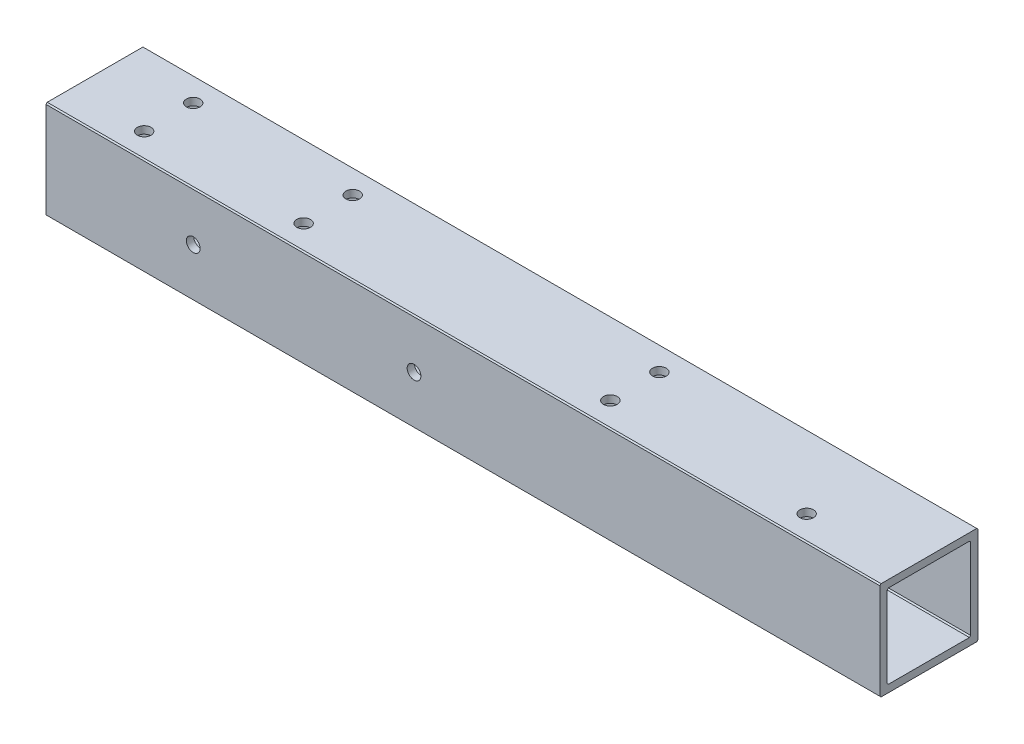
ISO-10303-21;
HEADER;
FILE_DESCRIPTION(('STEP AP214'),'2;1');
FILE_NAME('part.step','',(''),(''),'','','');
FILE_SCHEMA(('AUTOMOTIVE_DESIGN { 1 0 10303 214 1 1 1 1 }'));
ENDSEC;
DATA;
#1=APPLICATION_CONTEXT('core data for automotive mechanical design processes');
#2=APPLICATION_PROTOCOL_DEFINITION('international standard','automotive_design',2000,#1);
#3=PRODUCT_CONTEXT('',#1,'mechanical');
#4=PRODUCT('Part','Part','',(#3));
#5=PRODUCT_RELATED_PRODUCT_CATEGORY('part','',(#4));
#6=PRODUCT_DEFINITION_FORMATION('','',#4);
#7=PRODUCT_DEFINITION_CONTEXT('part definition',#1,'design');
#8=PRODUCT_DEFINITION('design','',#6,#7);
#9=PRODUCT_DEFINITION_SHAPE('','',#8);
#10=(LENGTH_UNIT() NAMED_UNIT(*) SI_UNIT(.MILLI.,.METRE.));
#11=(NAMED_UNIT(*) PLANE_ANGLE_UNIT() SI_UNIT($,.RADIAN.));
#12=(NAMED_UNIT(*) SI_UNIT($,.STERADIAN.) SOLID_ANGLE_UNIT());
#13=UNCERTAINTY_MEASURE_WITH_UNIT(LENGTH_MEASURE(1.E-05),#10,'distance_accuracy_value','');
#14=(GEOMETRIC_REPRESENTATION_CONTEXT(3) GLOBAL_UNCERTAINTY_ASSIGNED_CONTEXT((#13)) GLOBAL_UNIT_ASSIGNED_CONTEXT((#10,
#11,#12)) REPRESENTATION_CONTEXT('',''));
#15=CARTESIAN_POINT('',(0.,0.,0.));
#16=DIRECTION('',(0.,0.,1.));
#17=DIRECTION('',(1.,0.,0.));
#18=AXIS2_PLACEMENT_3D('',#15,#16,#17);
#19=CARTESIAN_POINT('',(-250.,102.,140.));
#20=DIRECTION('',(0.,0.,1.));
#21=DIRECTION('',(1.,0.,0.));
#22=AXIS2_PLACEMENT_3D('',#19,#20,#21);
#23=PLANE('',#22);
#24=CARTESIAN_POINT('',(-100.,122.,140.));
#25=DIRECTION('',(0.,0.,-1.));
#26=DIRECTION('',(-1.,0.,0.));
#27=AXIS2_PLACEMENT_3D('',#24,#25,#26);
#28=CIRCLE('',#27,2.79999999999998);
#29=CARTESIAN_POINT('',(-102.8,122.,140.));
#30=VERTEX_POINT('',#29);
#31=EDGE_CURVE('E605',#30,#30,#28,.T.);
#32=ORIENTED_EDGE('',*,*,#31,.T.);
#33=EDGE_LOOP('',(#32));
#34=FACE_BOUND('',#33,.T.);
#35=CARTESIAN_POINT('',(-190.,122.,140.));
#36=DIRECTION('',(0.,0.,-1.));
#37=DIRECTION('',(-1.,0.,0.));
#38=AXIS2_PLACEMENT_3D('',#35,#36,#37);
#39=CIRCLE('',#38,2.8);
#40=CARTESIAN_POINT('',(-192.8,122.,140.));
#41=VERTEX_POINT('',#40);
#42=EDGE_CURVE('E617',#41,#41,#39,.T.);
#43=ORIENTED_EDGE('',*,*,#42,.T.);
#44=EDGE_LOOP('',(#43));
#45=FACE_BOUND('',#44,.T.);
#46=DIRECTION('',(0.,1.,0.));
#47=VECTOR('',#46,1.);
#48=CARTESIAN_POINT('',(89.85,102.,140.));
#49=LINE('',#48,#47);
#50=CARTESIAN_POINT('',(89.85,102.5,140.));
#51=VERTEX_POINT('',#50);
#52=CARTESIAN_POINT('',(89.85,141.5,140.));
#53=VERTEX_POINT('',#52);
#54=EDGE_CURVE('E185',#51,#53,#49,.T.);
#55=ORIENTED_EDGE('',*,*,#54,.T.);
#56=DIRECTION('',(-1.,0.,0.));
#57=VECTOR('',#56,1.);
#58=CARTESIAN_POINT('',(-250.,141.5,140.));
#59=LINE('',#58,#57);
#60=CARTESIAN_POINT('',(-250.,141.5,140.));
#61=VERTEX_POINT('',#60);
#62=EDGE_CURVE('E229',#53,#61,#59,.T.);
#63=ORIENTED_EDGE('',*,*,#62,.T.);
#64=DIRECTION('',(0.,1.,0.));
#65=VECTOR('',#64,1.);
#66=CARTESIAN_POINT('',(-250.,102.,140.));
#67=LINE('',#66,#65);
#68=CARTESIAN_POINT('',(-250.,102.5,140.));
#69=VERTEX_POINT('',#68);
#70=EDGE_CURVE('E196',#69,#61,#67,.T.);
#71=ORIENTED_EDGE('',*,*,#70,.F.);
#72=DIRECTION('',(1.,0.,0.));
#73=VECTOR('',#72,1.);
#74=CARTESIAN_POINT('',(89.85,102.5,140.));
#75=LINE('',#74,#73);
#76=EDGE_CURVE('E226',#69,#51,#75,.T.);
#77=ORIENTED_EDGE('',*,*,#76,.T.);
#78=EDGE_LOOP('',(#55,#63,#71,#77));
#79=FACE_BOUND('',#78,.T.);
#80=ADVANCED_FACE('F45',(#34,#45,#79),#23,.T.);
#81=CARTESIAN_POINT('',(-250.,102.,100.));
#82=DIRECTION('',(-1.,0.,0.));
#83=DIRECTION('',(0.,0.,1.));
#84=AXIS2_PLACEMENT_3D('',#81,#82,#83);
#85=PLANE('',#84);
#86=DIRECTION('',(0.,-1.,0.));
#87=VECTOR('',#86,1.);
#88=CARTESIAN_POINT('',(-250.,139.,103.));
#89=LINE('',#88,#87);
#90=CARTESIAN_POINT('',(-250.,138.5,103.));
#91=VERTEX_POINT('',#90);
#92=CARTESIAN_POINT('',(-250.,105.5,103.));
#93=VERTEX_POINT('',#92);
#94=EDGE_CURVE('E286',#91,#93,#89,.T.);
#95=ORIENTED_EDGE('',*,*,#94,.F.);
#96=DIRECTION('',(0.,-0.707106781186548,-0.707106781186548));
#97=VECTOR('',#96,1.);
#98=CARTESIAN_POINT('',(-250.,138.5,103.));
#99=LINE('',#98,#97);
#100=CARTESIAN_POINT('',(-250.,139.,103.5));
#101=VERTEX_POINT('',#100);
#102=EDGE_CURVE('E55',#91,#101,#99,.F.);
#103=ORIENTED_EDGE('',*,*,#102,.T.);
#104=DIRECTION('',(0.,0.,-1.));
#105=VECTOR('',#104,1.);
#106=CARTESIAN_POINT('',(-250.,139.,137.));
#107=LINE('',#106,#105);
#108=CARTESIAN_POINT('',(-250.,139.,136.5));
#109=VERTEX_POINT('',#108);
#110=EDGE_CURVE('E284',#109,#101,#107,.T.);
#111=ORIENTED_EDGE('',*,*,#110,.F.);
#112=DIRECTION('',(0.,0.707106781186548,-0.707106781186548));
#113=VECTOR('',#112,1.);
#114=CARTESIAN_POINT('',(-250.,139.,136.5));
#115=LINE('',#114,#113);
#116=CARTESIAN_POINT('',(-250.,138.5,137.));
#117=VERTEX_POINT('',#116);
#118=EDGE_CURVE('E260',#109,#117,#115,.F.);
#119=ORIENTED_EDGE('',*,*,#118,.T.);
#120=DIRECTION('',(0.,1.,0.));
#121=VECTOR('',#120,1.);
#122=CARTESIAN_POINT('',(-250.,105.,137.));
#123=LINE('',#122,#121);
#124=CARTESIAN_POINT('',(-250.,105.5,137.));
#125=VERTEX_POINT('',#124);
#126=EDGE_CURVE('E297',#125,#117,#123,.T.);
#127=ORIENTED_EDGE('',*,*,#126,.F.);
#128=DIRECTION('',(0.,0.707106781186548,0.707106781186548));
#129=VECTOR('',#128,1.);
#130=CARTESIAN_POINT('',(-250.,105.5,137.));
#131=LINE('',#130,#129);
#132=CARTESIAN_POINT('',(-250.,105.,136.5));
#133=VERTEX_POINT('',#132);
#134=EDGE_CURVE('E272',#125,#133,#131,.F.);
#135=ORIENTED_EDGE('',*,*,#134,.T.);
#136=DIRECTION('',(0.,0.,1.));
#137=VECTOR('',#136,1.);
#138=CARTESIAN_POINT('',(-250.,105.,103.));
#139=LINE('',#138,#137);
#140=CARTESIAN_POINT('',(-250.,105.,103.5));
#141=VERTEX_POINT('',#140);
#142=EDGE_CURVE('E327',#141,#133,#139,.T.);
#143=ORIENTED_EDGE('',*,*,#142,.F.);
#144=DIRECTION('',(0.,-0.707106781186548,0.707106781186548));
#145=VECTOR('',#144,1.);
#146=CARTESIAN_POINT('',(-250.,105.,103.5));
#147=LINE('',#146,#145);
#148=EDGE_CURVE('E266',#141,#93,#147,.F.);
#149=ORIENTED_EDGE('',*,*,#148,.T.);
#150=EDGE_LOOP('',(#95,#103,#111,#119,#127,#135,#143,#149));
#151=FACE_BOUND('',#150,.T.);
#152=DIRECTION('',(0.,1.,0.));
#153=VECTOR('',#152,1.);
#154=CARTESIAN_POINT('',(-250.,102.,100.));
#155=LINE('',#154,#153);
#156=CARTESIAN_POINT('',(-250.,102.5,100.));
#157=VERTEX_POINT('',#156);
#158=CARTESIAN_POINT('',(-250.,141.5,100.));
#159=VERTEX_POINT('',#158);
#160=EDGE_CURVE('E184',#157,#159,#155,.T.);
#161=ORIENTED_EDGE('',*,*,#160,.F.);
#162=DIRECTION('',(0.,-0.707106781186548,0.707106781186548));
#163=VECTOR('',#162,1.);
#164=CARTESIAN_POINT('',(-250.,102.25,100.25));
#165=LINE('',#164,#163);
#166=CARTESIAN_POINT('',(-250.,102.,100.5));
#167=VERTEX_POINT('',#166);
#168=EDGE_CURVE('E188',#157,#167,#165,.T.);
#169=ORIENTED_EDGE('',*,*,#168,.T.);
#170=DIRECTION('',(0.,0.,1.));
#171=VECTOR('',#170,1.);
#172=CARTESIAN_POINT('',(-250.,102.,100.));
#173=LINE('',#172,#171);
#174=CARTESIAN_POINT('',(-250.,102.,139.5));
#175=VERTEX_POINT('',#174);
#176=EDGE_CURVE('E336',#167,#175,#173,.T.);
#177=ORIENTED_EDGE('',*,*,#176,.T.);
#178=DIRECTION('',(0.,0.707106781186548,0.707106781186548));
#179=VECTOR('',#178,1.);
#180=CARTESIAN_POINT('',(-250.,82.25,119.75));
#181=LINE('',#180,#179);
#182=EDGE_CURVE('E190',#175,#69,#181,.T.);
#183=ORIENTED_EDGE('',*,*,#182,.T.);
#184=ORIENTED_EDGE('',*,*,#70,.T.);
#185=DIRECTION('',(0.,-0.707106781186548,0.707106781186548));
#186=VECTOR('',#185,1.);
#187=CARTESIAN_POINT('',(-250.,141.75,139.75));
#188=LINE('',#187,#186);
#189=CARTESIAN_POINT('',(-250.,142.,139.5));
#190=VERTEX_POINT('',#189);
#191=EDGE_CURVE('E194',#61,#190,#188,.F.);
#192=ORIENTED_EDGE('',*,*,#191,.T.);
#193=DIRECTION('',(0.,0.,1.));
#194=VECTOR('',#193,1.);
#195=CARTESIAN_POINT('',(-250.,142.,100.));
#196=LINE('',#195,#194);
#197=CARTESIAN_POINT('',(-250.,142.,100.5));
#198=VERTEX_POINT('',#197);
#199=EDGE_CURVE('E337',#198,#190,#196,.T.);
#200=ORIENTED_EDGE('',*,*,#199,.F.);
#201=DIRECTION('',(0.,0.707106781186548,0.707106781186548));
#202=VECTOR('',#201,1.);
#203=CARTESIAN_POINT('',(-250.,121.75,80.25));
#204=LINE('',#203,#202);
#205=EDGE_CURVE('E202',#198,#159,#204,.F.);
#206=ORIENTED_EDGE('',*,*,#205,.T.);
#207=EDGE_LOOP('',(#161,#169,#177,#183,#184,#192,#200,#206));
#208=FACE_BOUND('',#207,.T.);
#209=ADVANCED_FACE('F282',(#151,#208),#85,.T.);
#210=CARTESIAN_POINT('',(89.85,102.,100.));
#211=DIRECTION('',(0.,0.,-1.));
#212=DIRECTION('',(-1.,0.,0.));
#213=AXIS2_PLACEMENT_3D('',#210,#211,#212);
#214=PLANE('',#213);
#215=CARTESIAN_POINT('',(-100.,122.,100.));
#216=DIRECTION('',(0.,0.,-1.));
#217=DIRECTION('',(-1.,0.,0.));
#218=AXIS2_PLACEMENT_3D('',#215,#216,#217);
#219=CIRCLE('',#218,2.79999999999998);
#220=CARTESIAN_POINT('',(-102.8,122.,100.));
#221=VERTEX_POINT('',#220);
#222=EDGE_CURVE('E476',#221,#221,#219,.T.);
#223=ORIENTED_EDGE('',*,*,#222,.F.);
#224=EDGE_LOOP('',(#223));
#225=FACE_BOUND('',#224,.T.);
#226=CARTESIAN_POINT('',(-190.,122.,100.));
#227=DIRECTION('',(0.,0.,-1.));
#228=DIRECTION('',(-1.,0.,0.));
#229=AXIS2_PLACEMENT_3D('',#226,#227,#228);
#230=CIRCLE('',#229,2.8);
#231=CARTESIAN_POINT('',(-192.8,122.,100.));
#232=VERTEX_POINT('',#231);
#233=EDGE_CURVE('E479',#232,#232,#230,.T.);
#234=ORIENTED_EDGE('',*,*,#233,.F.);
#235=EDGE_LOOP('',(#234));
#236=FACE_BOUND('',#235,.T.);
#237=DIRECTION('',(0.,1.,0.));
#238=VECTOR('',#237,1.);
#239=CARTESIAN_POINT('',(89.85,102.,100.));
#240=LINE('',#239,#238);
#241=CARTESIAN_POINT('',(89.85,102.5,100.));
#242=VERTEX_POINT('',#241);
#243=CARTESIAN_POINT('',(89.85,141.5,100.));
#244=VERTEX_POINT('',#243);
#245=EDGE_CURVE('E164',#242,#244,#240,.T.);
#246=ORIENTED_EDGE('',*,*,#245,.F.);
#247=DIRECTION('',(-1.,0.,0.));
#248=VECTOR('',#247,1.);
#249=CARTESIAN_POINT('',(-250.,102.5,100.));
#250=LINE('',#249,#248);
#251=EDGE_CURVE('E179',#242,#157,#250,.T.);
#252=ORIENTED_EDGE('',*,*,#251,.T.);
#253=ORIENTED_EDGE('',*,*,#160,.T.);
#254=DIRECTION('',(1.,0.,0.));
#255=VECTOR('',#254,1.);
#256=CARTESIAN_POINT('',(89.85,141.5,100.));
#257=LINE('',#256,#255);
#258=EDGE_CURVE('E182',#159,#244,#257,.T.);
#259=ORIENTED_EDGE('',*,*,#258,.T.);
#260=EDGE_LOOP('',(#246,#252,#253,#259));
#261=FACE_BOUND('',#260,.T.);
#262=ADVANCED_FACE('F177',(#225,#236,#261),#214,.T.);
#263=CARTESIAN_POINT('',(89.85,102.,140.));
#264=DIRECTION('',(1.,0.,0.));
#265=DIRECTION('',(0.,0.,-1.));
#266=AXIS2_PLACEMENT_3D('',#263,#264,#265);
#267=PLANE('',#266);
#268=DIRECTION('',(0.,0.,-1.));
#269=VECTOR('',#268,1.);
#270=CARTESIAN_POINT('',(89.85,139.,137.));
#271=LINE('',#270,#269);
#272=CARTESIAN_POINT('',(89.85,139.,136.5));
#273=VERTEX_POINT('',#272);
#274=CARTESIAN_POINT('',(89.85,139.,103.5));
#275=VERTEX_POINT('',#274);
#276=EDGE_CURVE('E304',#273,#275,#271,.T.);
#277=ORIENTED_EDGE('',*,*,#276,.T.);
#278=DIRECTION('',(0.,0.707106781186548,0.707106781186548));
#279=VECTOR('',#278,1.);
#280=CARTESIAN_POINT('',(89.85,138.5,103.));
#281=LINE('',#280,#279);
#282=CARTESIAN_POINT('',(89.85,138.5,103.));
#283=VERTEX_POINT('',#282);
#284=EDGE_CURVE('E11',#275,#283,#281,.F.);
#285=ORIENTED_EDGE('',*,*,#284,.T.);
#286=DIRECTION('',(0.,-1.,0.));
#287=VECTOR('',#286,1.);
#288=CARTESIAN_POINT('',(89.85,139.,103.));
#289=LINE('',#288,#287);
#290=CARTESIAN_POINT('',(89.85,105.5,103.));
#291=VERTEX_POINT('',#290);
#292=EDGE_CURVE('E296',#283,#291,#289,.T.);
#293=ORIENTED_EDGE('',*,*,#292,.T.);
#294=DIRECTION('',(0.,0.707106781186548,-0.707106781186548));
#295=VECTOR('',#294,1.);
#296=CARTESIAN_POINT('',(89.85,105.,103.5));
#297=LINE('',#296,#295);
#298=CARTESIAN_POINT('',(89.85,105.,103.5));
#299=VERTEX_POINT('',#298);
#300=EDGE_CURVE('E269',#291,#299,#297,.F.);
#301=ORIENTED_EDGE('',*,*,#300,.T.);
#302=DIRECTION('',(0.,0.,1.));
#303=VECTOR('',#302,1.);
#304=CARTESIAN_POINT('',(89.85,105.,103.));
#305=LINE('',#304,#303);
#306=CARTESIAN_POINT('',(89.85,105.,136.5));
#307=VERTEX_POINT('',#306);
#308=EDGE_CURVE('E309',#299,#307,#305,.T.);
#309=ORIENTED_EDGE('',*,*,#308,.T.);
#310=DIRECTION('',(0.,-0.707106781186548,-0.707106781186548));
#311=VECTOR('',#310,1.);
#312=CARTESIAN_POINT('',(89.85,105.5,137.));
#313=LINE('',#312,#311);
#314=CARTESIAN_POINT('',(89.85,105.5,137.));
#315=VERTEX_POINT('',#314);
#316=EDGE_CURVE('E275',#307,#315,#313,.F.);
#317=ORIENTED_EDGE('',*,*,#316,.T.);
#318=DIRECTION('',(0.,1.,0.));
#319=VECTOR('',#318,1.);
#320=CARTESIAN_POINT('',(89.85,105.,137.));
#321=LINE('',#320,#319);
#322=CARTESIAN_POINT('',(89.85,138.5,137.));
#323=VERTEX_POINT('',#322);
#324=EDGE_CURVE('E313',#315,#323,#321,.T.);
#325=ORIENTED_EDGE('',*,*,#324,.T.);
#326=DIRECTION('',(0.,-0.707106781186548,0.707106781186548));
#327=VECTOR('',#326,1.);
#328=CARTESIAN_POINT('',(89.85,139.,136.5));
#329=LINE('',#328,#327);
#330=EDGE_CURVE('E263',#323,#273,#329,.F.);
#331=ORIENTED_EDGE('',*,*,#330,.T.);
#332=EDGE_LOOP('',(#277,#285,#293,#301,#309,#317,#325,#331));
#333=FACE_BOUND('',#332,.T.);
#334=DIRECTION('',(0.,0.,-1.));
#335=VECTOR('',#334,1.);
#336=CARTESIAN_POINT('',(89.85,102.,140.));
#337=LINE('',#336,#335);
#338=CARTESIAN_POINT('',(89.85,102.,139.5));
#339=VERTEX_POINT('',#338);
#340=CARTESIAN_POINT('',(89.85,102.,100.5));
#341=VERTEX_POINT('',#340);
#342=EDGE_CURVE('E167',#339,#341,#337,.T.);
#343=ORIENTED_EDGE('',*,*,#342,.T.);
#344=DIRECTION('',(0.,0.707106781186548,-0.707106781186548));
#345=VECTOR('',#344,1.);
#346=CARTESIAN_POINT('',(89.85,82.25,120.25));
#347=LINE('',#346,#345);
#348=EDGE_CURVE('E161',#341,#242,#347,.T.);
#349=ORIENTED_EDGE('',*,*,#348,.T.);
#350=ORIENTED_EDGE('',*,*,#245,.T.);
#351=DIRECTION('',(0.,-0.707106781186548,-0.707106781186548));
#352=VECTOR('',#351,1.);
#353=CARTESIAN_POINT('',(89.85,141.75,100.25));
#354=LINE('',#353,#352);
#355=CARTESIAN_POINT('',(89.85,142.,100.5));
#356=VERTEX_POINT('',#355);
#357=EDGE_CURVE('E173',#244,#356,#354,.F.);
#358=ORIENTED_EDGE('',*,*,#357,.T.);
#359=DIRECTION('',(0.,0.,-1.));
#360=VECTOR('',#359,1.);
#361=CARTESIAN_POINT('',(89.85,142.,140.));
#362=LINE('',#361,#360);
#363=CARTESIAN_POINT('',(89.85,142.,139.5));
#364=VERTEX_POINT('',#363);
#365=EDGE_CURVE('E324',#364,#356,#362,.T.);
#366=ORIENTED_EDGE('',*,*,#365,.F.);
#367=DIRECTION('',(0.,0.707106781186548,-0.707106781186548));
#368=VECTOR('',#367,1.);
#369=CARTESIAN_POINT('',(89.85,121.75,159.75));
#370=LINE('',#369,#368);
#371=EDGE_CURVE('E62',#364,#53,#370,.F.);
#372=ORIENTED_EDGE('',*,*,#371,.T.);
#373=ORIENTED_EDGE('',*,*,#54,.F.);
#374=DIRECTION('',(0.,-0.707106781186548,-0.707106781186548));
#375=VECTOR('',#374,1.);
#376=CARTESIAN_POINT('',(89.85,102.25,139.75));
#377=LINE('',#376,#375);
#378=EDGE_CURVE('E70',#51,#339,#377,.T.);
#379=ORIENTED_EDGE('',*,*,#378,.T.);
#380=EDGE_LOOP('',(#343,#349,#350,#358,#366,#372,#373,#379));
#381=FACE_BOUND('',#380,.T.);
#382=ADVANCED_FACE('F163',(#333,#381),#267,.T.);
#383=CARTESIAN_POINT('',(0.,102.,0.));
#384=DIRECTION('',(0.,1.,0.));
#385=DIRECTION('',(0.,0.,1.));
#386=AXIS2_PLACEMENT_3D('',#383,#384,#385);
#387=PLANE('',#386);
#388=CARTESIAN_POINT('',(50.,102.,130.));
#389=DIRECTION('',(0.,1.,0.));
#390=DIRECTION('',(0.,0.,1.));
#391=AXIS2_PLACEMENT_3D('',#388,#389,#390);
#392=CIRCLE('',#391,2.79999999999998);
#393=CARTESIAN_POINT('',(50.,102.,132.8));
#394=VERTEX_POINT('',#393);
#395=EDGE_CURVE('E497',#394,#394,#392,.T.);
#396=ORIENTED_EDGE('',*,*,#395,.T.);
#397=EDGE_LOOP('',(#396));
#398=FACE_BOUND('',#397,.T.);
#399=CARTESIAN_POINT('',(-30.,102.,130.));
#400=DIRECTION('',(0.,1.,0.));
#401=DIRECTION('',(0.,0.,1.));
#402=AXIS2_PLACEMENT_3D('',#399,#400,#401);
#403=CIRCLE('',#402,2.79999999999998);
#404=CARTESIAN_POINT('',(-30.,102.,132.8));
#405=VERTEX_POINT('',#404);
#406=EDGE_CURVE('E505',#405,#405,#403,.T.);
#407=ORIENTED_EDGE('',*,*,#406,.T.);
#408=EDGE_LOOP('',(#407));
#409=FACE_BOUND('',#408,.T.);
#410=CARTESIAN_POINT('',(-30.,102.,110.));
#411=DIRECTION('',(0.,1.,0.));
#412=DIRECTION('',(0.,0.,1.));
#413=AXIS2_PLACEMENT_3D('',#410,#411,#412);
#414=CIRCLE('',#413,2.79999999999998);
#415=CARTESIAN_POINT('',(-30.,102.,112.8));
#416=VERTEX_POINT('',#415);
#417=EDGE_CURVE('E513',#416,#416,#414,.T.);
#418=ORIENTED_EDGE('',*,*,#417,.T.);
#419=EDGE_LOOP('',(#418));
#420=FACE_BOUND('',#419,.T.);
#421=CARTESIAN_POINT('',(-155.,102.,130.));
#422=DIRECTION('',(0.,1.,0.));
#423=DIRECTION('',(0.,0.,1.));
#424=AXIS2_PLACEMENT_3D('',#421,#422,#423);
#425=CIRCLE('',#424,2.8);
#426=CARTESIAN_POINT('',(-155.,102.,132.8));
#427=VERTEX_POINT('',#426);
#428=EDGE_CURVE('E521',#427,#427,#425,.T.);
#429=ORIENTED_EDGE('',*,*,#428,.T.);
#430=EDGE_LOOP('',(#429));
#431=FACE_BOUND('',#430,.T.);
#432=CARTESIAN_POINT('',(-220.,102.,130.));
#433=DIRECTION('',(0.,1.,0.));
#434=DIRECTION('',(0.,0.,1.));
#435=AXIS2_PLACEMENT_3D('',#432,#433,#434);
#436=CIRCLE('',#435,2.8);
#437=CARTESIAN_POINT('',(-220.,102.,132.8));
#438=VERTEX_POINT('',#437);
#439=EDGE_CURVE('E529',#438,#438,#436,.T.);
#440=ORIENTED_EDGE('',*,*,#439,.T.);
#441=EDGE_LOOP('',(#440));
#442=FACE_BOUND('',#441,.T.);
#443=CARTESIAN_POINT('',(-155.,102.,110.));
#444=DIRECTION('',(0.,1.,0.));
#445=DIRECTION('',(0.,0.,1.));
#446=AXIS2_PLACEMENT_3D('',#443,#444,#445);
#447=CIRCLE('',#446,2.8);
#448=CARTESIAN_POINT('',(-155.,102.,112.8));
#449=VERTEX_POINT('',#448);
#450=EDGE_CURVE('E537',#449,#449,#447,.T.);
#451=ORIENTED_EDGE('',*,*,#450,.T.);
#452=EDGE_LOOP('',(#451));
#453=FACE_BOUND('',#452,.T.);
#454=CARTESIAN_POINT('',(-220.,102.,110.));
#455=DIRECTION('',(0.,1.,0.));
#456=DIRECTION('',(0.,0.,1.));
#457=AXIS2_PLACEMENT_3D('',#454,#455,#456);
#458=CIRCLE('',#457,2.8);
#459=CARTESIAN_POINT('',(-220.,102.,112.8));
#460=VERTEX_POINT('',#459);
#461=EDGE_CURVE('E316',#460,#460,#458,.T.);
#462=ORIENTED_EDGE('',*,*,#461,.T.);
#463=EDGE_LOOP('',(#462));
#464=FACE_BOUND('',#463,.T.);
#465=ORIENTED_EDGE('',*,*,#176,.F.);
#466=DIRECTION('',(1.,0.,0.));
#467=VECTOR('',#466,1.);
#468=CARTESIAN_POINT('',(89.85,102.,100.5));
#469=LINE('',#468,#467);
#470=EDGE_CURVE('E210',#167,#341,#469,.T.);
#471=ORIENTED_EDGE('',*,*,#470,.T.);
#472=ORIENTED_EDGE('',*,*,#342,.F.);
#473=DIRECTION('',(-1.,0.,0.));
#474=VECTOR('',#473,1.);
#475=CARTESIAN_POINT('',(-250.,102.,139.5));
#476=LINE('',#475,#474);
#477=EDGE_CURVE('E207',#339,#175,#476,.T.);
#478=ORIENTED_EDGE('',*,*,#477,.T.);
#479=EDGE_LOOP('',(#465,#471,#472,#478));
#480=FACE_BOUND('',#479,.T.);
#481=ADVANCED_FACE('F368',(#398,#409,#420,#431,#442,#453,#464,#480),#387,.F.);
#482=CARTESIAN_POINT('',(0.,142.,0.));
#483=DIRECTION('',(0.,1.,0.));
#484=DIRECTION('',(0.,0.,1.));
#485=AXIS2_PLACEMENT_3D('',#482,#483,#484);
#486=PLANE('',#485);
#487=CARTESIAN_POINT('',(50.,142.,130.));
#488=DIRECTION('',(0.,1.,0.));
#489=DIRECTION('',(0.,0.,1.));
#490=AXIS2_PLACEMENT_3D('',#487,#488,#489);
#491=CIRCLE('',#490,2.79999999999998);
#492=CARTESIAN_POINT('',(50.,142.,132.8));
#493=VERTEX_POINT('',#492);
#494=EDGE_CURVE('E967',#493,#493,#491,.T.);
#495=ORIENTED_EDGE('',*,*,#494,.F.);
#496=EDGE_LOOP('',(#495));
#497=FACE_BOUND('',#496,.T.);
#498=CARTESIAN_POINT('',(-30.,142.,130.));
#499=DIRECTION('',(0.,1.,0.));
#500=DIRECTION('',(0.,0.,1.));
#501=AXIS2_PLACEMENT_3D('',#498,#499,#500);
#502=CIRCLE('',#501,2.79999999999998);
#503=CARTESIAN_POINT('',(-30.,142.,132.8));
#504=VERTEX_POINT('',#503);
#505=EDGE_CURVE('E969',#504,#504,#502,.T.);
#506=ORIENTED_EDGE('',*,*,#505,.F.);
#507=EDGE_LOOP('',(#506));
#508=FACE_BOUND('',#507,.T.);
#509=CARTESIAN_POINT('',(-30.,142.,110.));
#510=DIRECTION('',(0.,1.,0.));
#511=DIRECTION('',(0.,0.,1.));
#512=AXIS2_PLACEMENT_3D('',#509,#510,#511);
#513=CIRCLE('',#512,2.79999999999998);
#514=CARTESIAN_POINT('',(-30.,142.,112.8));
#515=VERTEX_POINT('',#514);
#516=EDGE_CURVE('E979',#515,#515,#513,.T.);
#517=ORIENTED_EDGE('',*,*,#516,.F.);
#518=EDGE_LOOP('',(#517));
#519=FACE_BOUND('',#518,.T.);
#520=CARTESIAN_POINT('',(-155.,142.,130.));
#521=DIRECTION('',(0.,1.,0.));
#522=DIRECTION('',(0.,0.,1.));
#523=AXIS2_PLACEMENT_3D('',#520,#521,#522);
#524=CIRCLE('',#523,2.8);
#525=CARTESIAN_POINT('',(-155.,142.,132.8));
#526=VERTEX_POINT('',#525);
#527=EDGE_CURVE('E985',#526,#526,#524,.T.);
#528=ORIENTED_EDGE('',*,*,#527,.F.);
#529=EDGE_LOOP('',(#528));
#530=FACE_BOUND('',#529,.T.);
#531=CARTESIAN_POINT('',(-220.,142.,130.));
#532=DIRECTION('',(0.,1.,0.));
#533=DIRECTION('',(0.,0.,1.));
#534=AXIS2_PLACEMENT_3D('',#531,#532,#533);
#535=CIRCLE('',#534,2.8);
#536=CARTESIAN_POINT('',(-220.,142.,132.8));
#537=VERTEX_POINT('',#536);
#538=EDGE_CURVE('E991',#537,#537,#535,.T.);
#539=ORIENTED_EDGE('',*,*,#538,.F.);
#540=EDGE_LOOP('',(#539));
#541=FACE_BOUND('',#540,.T.);
#542=CARTESIAN_POINT('',(-155.,142.,110.));
#543=DIRECTION('',(0.,1.,0.));
#544=DIRECTION('',(0.,0.,1.));
#545=AXIS2_PLACEMENT_3D('',#542,#543,#544);
#546=CIRCLE('',#545,2.8);
#547=CARTESIAN_POINT('',(-155.,142.,112.8));
#548=VERTEX_POINT('',#547);
#549=EDGE_CURVE('E997',#548,#548,#546,.T.);
#550=ORIENTED_EDGE('',*,*,#549,.F.);
#551=EDGE_LOOP('',(#550));
#552=FACE_BOUND('',#551,.T.);
#553=CARTESIAN_POINT('',(-220.,142.,110.));
#554=DIRECTION('',(0.,1.,0.));
#555=DIRECTION('',(0.,0.,1.));
#556=AXIS2_PLACEMENT_3D('',#553,#554,#555);
#557=CIRCLE('',#556,2.8);
#558=CARTESIAN_POINT('',(-220.,142.,112.8));
#559=VERTEX_POINT('',#558);
#560=EDGE_CURVE('E600',#559,#559,#557,.T.);
#561=ORIENTED_EDGE('',*,*,#560,.F.);
#562=EDGE_LOOP('',(#561));
#563=FACE_BOUND('',#562,.T.);
#564=ORIENTED_EDGE('',*,*,#365,.T.);
#565=DIRECTION('',(-1.,0.,0.));
#566=VECTOR('',#565,1.);
#567=CARTESIAN_POINT('',(0.,142.,100.5));
#568=LINE('',#567,#566);
#569=EDGE_CURVE('E222',#356,#198,#568,.T.);
#570=ORIENTED_EDGE('',*,*,#569,.T.);
#571=ORIENTED_EDGE('',*,*,#199,.T.);
#572=DIRECTION('',(1.,0.,0.));
#573=VECTOR('',#572,1.);
#574=CARTESIAN_POINT('',(0.,142.,139.5));
#575=LINE('',#574,#573);
#576=EDGE_CURVE('E172',#190,#364,#575,.T.);
#577=ORIENTED_EDGE('',*,*,#576,.T.);
#578=EDGE_LOOP('',(#564,#570,#571,#577));
#579=FACE_BOUND('',#578,.T.);
#580=ADVANCED_FACE('F361',(#497,#508,#519,#530,#541,#552,#563,#579),#486,.T.);
#581=CARTESIAN_POINT('',(89.85,139.,103.));
#582=DIRECTION('',(0.,0.,-1.));
#583=DIRECTION('',(-1.,0.,0.));
#584=AXIS2_PLACEMENT_3D('',#581,#582,#583);
#585=PLANE('',#584);
#586=CARTESIAN_POINT('',(-100.,122.,103.));
#587=DIRECTION('',(0.,0.,-1.));
#588=DIRECTION('',(-1.,0.,0.));
#589=AXIS2_PLACEMENT_3D('',#586,#587,#588);
#590=CIRCLE('',#589,2.79999999999999);
#591=CARTESIAN_POINT('',(-102.8,122.,103.));
#592=VERTEX_POINT('',#591);
#593=EDGE_CURVE('E483',#592,#592,#590,.T.);
#594=ORIENTED_EDGE('',*,*,#593,.T.);
#595=EDGE_LOOP('',(#594));
#596=FACE_BOUND('',#595,.T.);
#597=CARTESIAN_POINT('',(-190.,122.,103.));
#598=DIRECTION('',(0.,0.,-1.));
#599=DIRECTION('',(-1.,0.,0.));
#600=AXIS2_PLACEMENT_3D('',#597,#598,#599);
#601=CIRCLE('',#600,2.8);
#602=CARTESIAN_POINT('',(-192.8,122.,103.));
#603=VERTEX_POINT('',#602);
#604=EDGE_CURVE('E482',#603,#603,#601,.T.);
#605=ORIENTED_EDGE('',*,*,#604,.T.);
#606=EDGE_LOOP('',(#605));
#607=FACE_BOUND('',#606,.T.);
#608=ORIENTED_EDGE('',*,*,#94,.T.);
#609=DIRECTION('',(1.,0.,0.));
#610=VECTOR('',#609,1.);
#611=CARTESIAN_POINT('',(89.85,105.5,103.));
#612=LINE('',#611,#610);
#613=EDGE_CURVE('E257',#93,#291,#612,.T.);
#614=ORIENTED_EDGE('',*,*,#613,.T.);
#615=ORIENTED_EDGE('',*,*,#292,.F.);
#616=DIRECTION('',(-1.,0.,0.));
#617=VECTOR('',#616,1.);
#618=CARTESIAN_POINT('',(-250.,138.5,103.));
#619=LINE('',#618,#617);
#620=EDGE_CURVE('E253',#283,#91,#619,.T.);
#621=ORIENTED_EDGE('',*,*,#620,.T.);
#622=EDGE_LOOP('',(#608,#614,#615,#621));
#623=FACE_BOUND('',#622,.T.);
#624=ADVANCED_FACE('F306',(#596,#607,#623),#585,.F.);
#625=CARTESIAN_POINT('',(89.85,139.,137.));
#626=DIRECTION('',(0.,1.,0.));
#627=DIRECTION('',(0.,0.,1.));
#628=AXIS2_PLACEMENT_3D('',#625,#626,#627);
#629=PLANE('',#628);
#630=CARTESIAN_POINT('',(50.,139.,130.));
#631=DIRECTION('',(0.,1.,0.));
#632=DIRECTION('',(0.,0.,1.));
#633=AXIS2_PLACEMENT_3D('',#630,#631,#632);
#634=CIRCLE('',#633,2.79999999999998);
#635=CARTESIAN_POINT('',(50.,139.,132.8));
#636=VERTEX_POINT('',#635);
#637=EDGE_CURVE('E573',#636,#636,#634,.T.);
#638=ORIENTED_EDGE('',*,*,#637,.T.);
#639=EDGE_LOOP('',(#638));
#640=FACE_BOUND('',#639,.T.);
#641=CARTESIAN_POINT('',(-30.,139.,130.));
#642=DIRECTION('',(0.,1.,0.));
#643=DIRECTION('',(0.,0.,1.));
#644=AXIS2_PLACEMENT_3D('',#641,#642,#643);
#645=CIRCLE('',#644,2.79999999999998);
#646=CARTESIAN_POINT('',(-30.,139.,132.8));
#647=VERTEX_POINT('',#646);
#648=EDGE_CURVE('E577',#647,#647,#645,.T.);
#649=ORIENTED_EDGE('',*,*,#648,.T.);
#650=EDGE_LOOP('',(#649));
#651=FACE_BOUND('',#650,.T.);
#652=CARTESIAN_POINT('',(-30.,139.,110.));
#653=DIRECTION('',(0.,1.,0.));
#654=DIRECTION('',(0.,0.,1.));
#655=AXIS2_PLACEMENT_3D('',#652,#653,#654);
#656=CIRCLE('',#655,2.79999999999998);
#657=CARTESIAN_POINT('',(-30.,139.,112.8));
#658=VERTEX_POINT('',#657);
#659=EDGE_CURVE('E581',#658,#658,#656,.T.);
#660=ORIENTED_EDGE('',*,*,#659,.T.);
#661=EDGE_LOOP('',(#660));
#662=FACE_BOUND('',#661,.T.);
#663=CARTESIAN_POINT('',(-155.,139.,130.));
#664=DIRECTION('',(0.,1.,0.));
#665=DIRECTION('',(0.,0.,1.));
#666=AXIS2_PLACEMENT_3D('',#663,#664,#665);
#667=CIRCLE('',#666,2.79999999999998);
#668=CARTESIAN_POINT('',(-155.,139.,132.8));
#669=VERTEX_POINT('',#668);
#670=EDGE_CURVE('E585',#669,#669,#667,.T.);
#671=ORIENTED_EDGE('',*,*,#670,.T.);
#672=EDGE_LOOP('',(#671));
#673=FACE_BOUND('',#672,.T.);
#674=CARTESIAN_POINT('',(-220.,139.,130.));
#675=DIRECTION('',(0.,1.,0.));
#676=DIRECTION('',(0.,0.,1.));
#677=AXIS2_PLACEMENT_3D('',#674,#675,#676);
#678=CIRCLE('',#677,2.79999999999998);
#679=CARTESIAN_POINT('',(-220.,139.,132.8));
#680=VERTEX_POINT('',#679);
#681=EDGE_CURVE('E589',#680,#680,#678,.T.);
#682=ORIENTED_EDGE('',*,*,#681,.T.);
#683=EDGE_LOOP('',(#682));
#684=FACE_BOUND('',#683,.T.);
#685=CARTESIAN_POINT('',(-155.,139.,110.));
#686=DIRECTION('',(0.,1.,0.));
#687=DIRECTION('',(0.,0.,1.));
#688=AXIS2_PLACEMENT_3D('',#685,#686,#687);
#689=CIRCLE('',#688,2.79999999999998);
#690=CARTESIAN_POINT('',(-155.,139.,112.8));
#691=VERTEX_POINT('',#690);
#692=EDGE_CURVE('E593',#691,#691,#689,.T.);
#693=ORIENTED_EDGE('',*,*,#692,.T.);
#694=EDGE_LOOP('',(#693));
#695=FACE_BOUND('',#694,.T.);
#696=CARTESIAN_POINT('',(-220.,139.,110.));
#697=DIRECTION('',(0.,1.,0.));
#698=DIRECTION('',(0.,0.,1.));
#699=AXIS2_PLACEMENT_3D('',#696,#697,#698);
#700=CIRCLE('',#699,2.79999999999998);
#701=CARTESIAN_POINT('',(-220.,139.,112.8));
#702=VERTEX_POINT('',#701);
#703=EDGE_CURVE('E596',#702,#702,#700,.T.);
#704=ORIENTED_EDGE('',*,*,#703,.T.);
#705=EDGE_LOOP('',(#704));
#706=FACE_BOUND('',#705,.T.);
#707=ORIENTED_EDGE('',*,*,#276,.F.);
#708=DIRECTION('',(-1.,0.,0.));
#709=VECTOR('',#708,1.);
#710=CARTESIAN_POINT('',(-250.,139.,136.5));
#711=LINE('',#710,#709);
#712=EDGE_CURVE('E235',#273,#109,#711,.T.);
#713=ORIENTED_EDGE('',*,*,#712,.T.);
#714=ORIENTED_EDGE('',*,*,#110,.T.);
#715=DIRECTION('',(1.,0.,0.));
#716=VECTOR('',#715,1.);
#717=CARTESIAN_POINT('',(89.85,139.,103.5));
#718=LINE('',#717,#716);
#719=EDGE_CURVE('E232',#101,#275,#718,.T.);
#720=ORIENTED_EDGE('',*,*,#719,.T.);
#721=EDGE_LOOP('',(#707,#713,#714,#720));
#722=FACE_BOUND('',#721,.T.);
#723=ADVANCED_FACE('F292',(#640,#651,#662,#673,#684,#695,#706,#722),#629,.F.);
#724=CARTESIAN_POINT('',(89.85,105.,137.));
#725=DIRECTION('',(0.,0.,1.));
#726=DIRECTION('',(1.,0.,0.));
#727=AXIS2_PLACEMENT_3D('',#724,#725,#726);
#728=PLANE('',#727);
#729=CARTESIAN_POINT('',(-100.,122.,137.));
#730=DIRECTION('',(0.,0.,-1.));
#731=DIRECTION('',(-1.,0.,0.));
#732=AXIS2_PLACEMENT_3D('',#729,#730,#731);
#733=CIRCLE('',#732,2.79999999999998);
#734=CARTESIAN_POINT('',(-102.8,122.,137.));
#735=VERTEX_POINT('',#734);
#736=EDGE_CURVE('E599',#735,#735,#733,.T.);
#737=ORIENTED_EDGE('',*,*,#736,.F.);
#738=EDGE_LOOP('',(#737));
#739=FACE_BOUND('',#738,.T.);
#740=CARTESIAN_POINT('',(-190.,122.,137.));
#741=DIRECTION('',(0.,0.,-1.));
#742=DIRECTION('',(-1.,0.,0.));
#743=AXIS2_PLACEMENT_3D('',#740,#741,#742);
#744=CIRCLE('',#743,2.8);
#745=CARTESIAN_POINT('',(-192.8,122.,137.));
#746=VERTEX_POINT('',#745);
#747=EDGE_CURVE('E613',#746,#746,#744,.T.);
#748=ORIENTED_EDGE('',*,*,#747,.F.);
#749=EDGE_LOOP('',(#748));
#750=FACE_BOUND('',#749,.T.);
#751=ORIENTED_EDGE('',*,*,#126,.T.);
#752=DIRECTION('',(1.,0.,0.));
#753=VECTOR('',#752,1.);
#754=CARTESIAN_POINT('',(89.85,138.5,137.));
#755=LINE('',#754,#753);
#756=EDGE_CURVE('E243',#117,#323,#755,.T.);
#757=ORIENTED_EDGE('',*,*,#756,.T.);
#758=ORIENTED_EDGE('',*,*,#324,.F.);
#759=DIRECTION('',(-1.,0.,0.));
#760=VECTOR('',#759,1.);
#761=CARTESIAN_POINT('',(-250.,105.5,137.));
#762=LINE('',#761,#760);
#763=EDGE_CURVE('E239',#315,#125,#762,.T.);
#764=ORIENTED_EDGE('',*,*,#763,.T.);
#765=EDGE_LOOP('',(#751,#757,#758,#764));
#766=FACE_BOUND('',#765,.T.);
#767=ADVANCED_FACE('F436',(#739,#750,#766),#728,.F.);
#768=CARTESIAN_POINT('',(89.85,105.,103.));
#769=DIRECTION('',(0.,-1.,0.));
#770=DIRECTION('',(0.,0.,-1.));
#771=AXIS2_PLACEMENT_3D('',#768,#769,#770);
#772=PLANE('',#771);
#773=CARTESIAN_POINT('',(50.,105.,130.));
#774=DIRECTION('',(0.,1.,0.));
#775=DIRECTION('',(0.,0.,1.));
#776=AXIS2_PLACEMENT_3D('',#773,#774,#775);
#777=CIRCLE('',#776,2.79999999999998);
#778=CARTESIAN_POINT('',(50.,105.,132.8));
#779=VERTEX_POINT('',#778);
#780=EDGE_CURVE('E488',#779,#779,#777,.T.);
#781=ORIENTED_EDGE('',*,*,#780,.F.);
#782=EDGE_LOOP('',(#781));
#783=FACE_BOUND('',#782,.T.);
#784=CARTESIAN_POINT('',(-30.,105.,130.));
#785=DIRECTION('',(0.,1.,0.));
#786=DIRECTION('',(0.,0.,1.));
#787=AXIS2_PLACEMENT_3D('',#784,#785,#786);
#788=CIRCLE('',#787,2.79999999999998);
#789=CARTESIAN_POINT('',(-30.,105.,132.8));
#790=VERTEX_POINT('',#789);
#791=EDGE_CURVE('E501',#790,#790,#788,.T.);
#792=ORIENTED_EDGE('',*,*,#791,.F.);
#793=EDGE_LOOP('',(#792));
#794=FACE_BOUND('',#793,.T.);
#795=CARTESIAN_POINT('',(-30.,105.,110.));
#796=DIRECTION('',(0.,1.,0.));
#797=DIRECTION('',(0.,0.,1.));
#798=AXIS2_PLACEMENT_3D('',#795,#796,#797);
#799=CIRCLE('',#798,2.79999999999998);
#800=CARTESIAN_POINT('',(-30.,105.,112.8));
#801=VERTEX_POINT('',#800);
#802=EDGE_CURVE('E509',#801,#801,#799,.T.);
#803=ORIENTED_EDGE('',*,*,#802,.F.);
#804=EDGE_LOOP('',(#803));
#805=FACE_BOUND('',#804,.T.);
#806=CARTESIAN_POINT('',(-155.,105.,130.));
#807=DIRECTION('',(0.,1.,0.));
#808=DIRECTION('',(0.,0.,1.));
#809=AXIS2_PLACEMENT_3D('',#806,#807,#808);
#810=CIRCLE('',#809,2.8);
#811=CARTESIAN_POINT('',(-155.,105.,132.8));
#812=VERTEX_POINT('',#811);
#813=EDGE_CURVE('E517',#812,#812,#810,.T.);
#814=ORIENTED_EDGE('',*,*,#813,.F.);
#815=EDGE_LOOP('',(#814));
#816=FACE_BOUND('',#815,.T.);
#817=CARTESIAN_POINT('',(-220.,105.,130.));
#818=DIRECTION('',(0.,1.,0.));
#819=DIRECTION('',(0.,0.,1.));
#820=AXIS2_PLACEMENT_3D('',#817,#818,#819);
#821=CIRCLE('',#820,2.8);
#822=CARTESIAN_POINT('',(-220.,105.,132.8));
#823=VERTEX_POINT('',#822);
#824=EDGE_CURVE('E525',#823,#823,#821,.T.);
#825=ORIENTED_EDGE('',*,*,#824,.F.);
#826=EDGE_LOOP('',(#825));
#827=FACE_BOUND('',#826,.T.);
#828=CARTESIAN_POINT('',(-155.,105.,110.));
#829=DIRECTION('',(0.,1.,0.));
#830=DIRECTION('',(0.,0.,1.));
#831=AXIS2_PLACEMENT_3D('',#828,#829,#830);
#832=CIRCLE('',#831,2.8);
#833=CARTESIAN_POINT('',(-155.,105.,112.8));
#834=VERTEX_POINT('',#833);
#835=EDGE_CURVE('E533',#834,#834,#832,.T.);
#836=ORIENTED_EDGE('',*,*,#835,.F.);
#837=EDGE_LOOP('',(#836));
#838=FACE_BOUND('',#837,.T.);
#839=CARTESIAN_POINT('',(-220.,105.,110.));
#840=DIRECTION('',(0.,1.,0.));
#841=DIRECTION('',(0.,0.,1.));
#842=AXIS2_PLACEMENT_3D('',#839,#840,#841);
#843=CIRCLE('',#842,2.8);
#844=CARTESIAN_POINT('',(-220.,105.,112.8));
#845=VERTEX_POINT('',#844);
#846=EDGE_CURVE('E540',#845,#845,#843,.T.);
#847=ORIENTED_EDGE('',*,*,#846,.F.);
#848=EDGE_LOOP('',(#847));
#849=FACE_BOUND('',#848,.T.);
#850=ORIENTED_EDGE('',*,*,#308,.F.);
#851=DIRECTION('',(-1.,0.,0.));
#852=VECTOR('',#851,1.);
#853=CARTESIAN_POINT('',(-250.,105.,103.5));
#854=LINE('',#853,#852);
#855=EDGE_CURVE('E249',#299,#141,#854,.T.);
#856=ORIENTED_EDGE('',*,*,#855,.T.);
#857=ORIENTED_EDGE('',*,*,#142,.T.);
#858=DIRECTION('',(1.,0.,0.));
#859=VECTOR('',#858,1.);
#860=CARTESIAN_POINT('',(89.85,105.,136.5));
#861=LINE('',#860,#859);
#862=EDGE_CURVE('E246',#133,#307,#861,.T.);
#863=ORIENTED_EDGE('',*,*,#862,.T.);
#864=EDGE_LOOP('',(#850,#856,#857,#863));
#865=FACE_BOUND('',#864,.T.);
#866=ADVANCED_FACE('F441',(#783,#794,#805,#816,#827,#838,#849,#865),#772,.F.);
#867=CARTESIAN_POINT('',(-220.,105.,110.));
#868=DIRECTION('',(0.,1.,0.));
#869=DIRECTION('',(0.,0.,1.));
#870=AXIS2_PLACEMENT_3D('',#867,#868,#869);
#871=CYLINDRICAL_SURFACE('',#870,2.8);
#872=ORIENTED_EDGE('',*,*,#461,.F.);
#873=EDGE_LOOP('',(#872));
#874=FACE_BOUND('',#873,.T.);
#875=ORIENTED_EDGE('',*,*,#846,.T.);
#876=EDGE_LOOP('',(#875));
#877=FACE_BOUND('',#876,.T.);
#878=ADVANCED_FACE('F444',(#874,#877),#871,.F.);
#879=CARTESIAN_POINT('',(-155.,105.,110.));
#880=DIRECTION('',(0.,1.,0.));
#881=DIRECTION('',(0.,0.,1.));
#882=AXIS2_PLACEMENT_3D('',#879,#880,#881);
#883=CYLINDRICAL_SURFACE('',#882,2.8);
#884=ORIENTED_EDGE('',*,*,#450,.F.);
#885=EDGE_LOOP('',(#884));
#886=FACE_BOUND('',#885,.T.);
#887=ORIENTED_EDGE('',*,*,#835,.T.);
#888=EDGE_LOOP('',(#887));
#889=FACE_BOUND('',#888,.T.);
#890=ADVANCED_FACE('F451',(#886,#889),#883,.F.);
#891=CARTESIAN_POINT('',(-220.,105.,130.));
#892=DIRECTION('',(0.,1.,0.));
#893=DIRECTION('',(0.,0.,1.));
#894=AXIS2_PLACEMENT_3D('',#891,#892,#893);
#895=CYLINDRICAL_SURFACE('',#894,2.8);
#896=ORIENTED_EDGE('',*,*,#439,.F.);
#897=EDGE_LOOP('',(#896));
#898=FACE_BOUND('',#897,.T.);
#899=ORIENTED_EDGE('',*,*,#824,.T.);
#900=EDGE_LOOP('',(#899));
#901=FACE_BOUND('',#900,.T.);
#902=ADVANCED_FACE('F555',(#898,#901),#895,.F.);
#903=CARTESIAN_POINT('',(-155.,105.,130.));
#904=DIRECTION('',(0.,1.,0.));
#905=DIRECTION('',(0.,0.,1.));
#906=AXIS2_PLACEMENT_3D('',#903,#904,#905);
#907=CYLINDRICAL_SURFACE('',#906,2.8);
#908=ORIENTED_EDGE('',*,*,#428,.F.);
#909=EDGE_LOOP('',(#908));
#910=FACE_BOUND('',#909,.T.);
#911=ORIENTED_EDGE('',*,*,#813,.T.);
#912=EDGE_LOOP('',(#911));
#913=FACE_BOUND('',#912,.T.);
#914=ADVANCED_FACE('F562',(#910,#913),#907,.F.);
#915=CARTESIAN_POINT('',(-30.,105.,110.));
#916=DIRECTION('',(0.,1.,0.));
#917=DIRECTION('',(0.,0.,1.));
#918=AXIS2_PLACEMENT_3D('',#915,#916,#917);
#919=CYLINDRICAL_SURFACE('',#918,2.79999999999998);
#920=ORIENTED_EDGE('',*,*,#417,.F.);
#921=EDGE_LOOP('',(#920));
#922=FACE_BOUND('',#921,.T.);
#923=ORIENTED_EDGE('',*,*,#802,.T.);
#924=EDGE_LOOP('',(#923));
#925=FACE_BOUND('',#924,.T.);
#926=ADVANCED_FACE('F647',(#922,#925),#919,.F.);
#927=CARTESIAN_POINT('',(-30.,105.,130.));
#928=DIRECTION('',(0.,1.,0.));
#929=DIRECTION('',(0.,0.,1.));
#930=AXIS2_PLACEMENT_3D('',#927,#928,#929);
#931=CYLINDRICAL_SURFACE('',#930,2.79999999999998);
#932=ORIENTED_EDGE('',*,*,#406,.F.);
#933=EDGE_LOOP('',(#932));
#934=FACE_BOUND('',#933,.T.);
#935=ORIENTED_EDGE('',*,*,#791,.T.);
#936=EDGE_LOOP('',(#935));
#937=FACE_BOUND('',#936,.T.);
#938=ADVANCED_FACE('F643',(#934,#937),#931,.F.);
#939=CARTESIAN_POINT('',(50.,105.,130.));
#940=DIRECTION('',(0.,1.,0.));
#941=DIRECTION('',(0.,0.,1.));
#942=AXIS2_PLACEMENT_3D('',#939,#940,#941);
#943=CYLINDRICAL_SURFACE('',#942,2.79999999999998);
#944=ORIENTED_EDGE('',*,*,#395,.F.);
#945=EDGE_LOOP('',(#944));
#946=FACE_BOUND('',#945,.T.);
#947=ORIENTED_EDGE('',*,*,#780,.T.);
#948=EDGE_LOOP('',(#947));
#949=FACE_BOUND('',#948,.T.);
#950=ADVANCED_FACE('F635',(#946,#949),#943,.F.);
#951=CARTESIAN_POINT('',(-190.,122.,100.));
#952=DIRECTION('',(0.,0.,-1.));
#953=DIRECTION('',(-1.,0.,0.));
#954=AXIS2_PLACEMENT_3D('',#951,#952,#953);
#955=CYLINDRICAL_SURFACE('',#954,2.8);
#956=ORIENTED_EDGE('',*,*,#604,.F.);
#957=EDGE_LOOP('',(#956));
#958=FACE_BOUND('',#957,.T.);
#959=ORIENTED_EDGE('',*,*,#233,.T.);
#960=EDGE_LOOP('',(#959));
#961=FACE_BOUND('',#960,.T.);
#962=ADVANCED_FACE('F625',(#958,#961),#955,.F.);
#963=CARTESIAN_POINT('',(-100.,122.,100.));
#964=DIRECTION('',(0.,0.,-1.));
#965=DIRECTION('',(-1.,0.,0.));
#966=AXIS2_PLACEMENT_3D('',#963,#964,#965);
#967=CYLINDRICAL_SURFACE('',#966,2.79999999999999);
#968=ORIENTED_EDGE('',*,*,#593,.F.);
#969=EDGE_LOOP('',(#968));
#970=FACE_BOUND('',#969,.T.);
#971=ORIENTED_EDGE('',*,*,#222,.T.);
#972=EDGE_LOOP('',(#971));
#973=FACE_BOUND('',#972,.T.);
#974=ADVANCED_FACE('F622',(#970,#973),#967,.F.);
#975=CARTESIAN_POINT('',(-190.,122.,137.));
#976=DIRECTION('',(0.,0.,-1.));
#977=DIRECTION('',(-1.,0.,0.));
#978=AXIS2_PLACEMENT_3D('',#975,#976,#977);
#979=CYLINDRICAL_SURFACE('',#978,2.8);
#980=ORIENTED_EDGE('',*,*,#42,.F.);
#981=EDGE_LOOP('',(#980));
#982=FACE_BOUND('',#981,.T.);
#983=ORIENTED_EDGE('',*,*,#747,.T.);
#984=EDGE_LOOP('',(#983));
#985=FACE_BOUND('',#984,.T.);
#986=ADVANCED_FACE('F624',(#982,#985),#979,.F.);
#987=CARTESIAN_POINT('',(-100.,122.,137.));
#988=DIRECTION('',(0.,0.,-1.));
#989=DIRECTION('',(-1.,0.,0.));
#990=AXIS2_PLACEMENT_3D('',#987,#988,#989);
#991=CYLINDRICAL_SURFACE('',#990,2.79999999999998);
#992=ORIENTED_EDGE('',*,*,#31,.F.);
#993=EDGE_LOOP('',(#992));
#994=FACE_BOUND('',#993,.T.);
#995=ORIENTED_EDGE('',*,*,#736,.T.);
#996=EDGE_LOOP('',(#995));
#997=FACE_BOUND('',#996,.T.);
#998=ADVANCED_FACE('F632',(#994,#997),#991,.F.);
#999=CARTESIAN_POINT('',(-220.,142.,110.));
#1000=DIRECTION('',(0.,1.,0.));
#1001=DIRECTION('',(0.,0.,1.));
#1002=AXIS2_PLACEMENT_3D('',#999,#1000,#1001);
#1003=CYLINDRICAL_SURFACE('',#1002,2.79999999999998);
#1004=ORIENTED_EDGE('',*,*,#560,.T.);
#1005=EDGE_LOOP('',(#1004));
#1006=FACE_BOUND('',#1005,.T.);
#1007=ORIENTED_EDGE('',*,*,#703,.F.);
#1008=EDGE_LOOP('',(#1007));
#1009=FACE_BOUND('',#1008,.T.);
#1010=ADVANCED_FACE('F705',(#1006,#1009),#1003,.F.);
#1011=CARTESIAN_POINT('',(-155.,142.,110.));
#1012=DIRECTION('',(0.,1.,0.));
#1013=DIRECTION('',(0.,0.,1.));
#1014=AXIS2_PLACEMENT_3D('',#1011,#1012,#1013);
#1015=CYLINDRICAL_SURFACE('',#1014,2.79999999999998);
#1016=ORIENTED_EDGE('',*,*,#549,.T.);
#1017=EDGE_LOOP('',(#1016));
#1018=FACE_BOUND('',#1017,.T.);
#1019=ORIENTED_EDGE('',*,*,#692,.F.);
#1020=EDGE_LOOP('',(#1019));
#1021=FACE_BOUND('',#1020,.T.);
#1022=ADVANCED_FACE('F715',(#1018,#1021),#1015,.F.);
#1023=CARTESIAN_POINT('',(-220.,142.,130.));
#1024=DIRECTION('',(0.,1.,0.));
#1025=DIRECTION('',(0.,0.,1.));
#1026=AXIS2_PLACEMENT_3D('',#1023,#1024,#1025);
#1027=CYLINDRICAL_SURFACE('',#1026,2.79999999999998);
#1028=ORIENTED_EDGE('',*,*,#538,.T.);
#1029=EDGE_LOOP('',(#1028));
#1030=FACE_BOUND('',#1029,.T.);
#1031=ORIENTED_EDGE('',*,*,#681,.F.);
#1032=EDGE_LOOP('',(#1031));
#1033=FACE_BOUND('',#1032,.T.);
#1034=ADVANCED_FACE('F726',(#1030,#1033),#1027,.F.);
#1035=CARTESIAN_POINT('',(-155.,142.,130.));
#1036=DIRECTION('',(0.,1.,0.));
#1037=DIRECTION('',(0.,0.,1.));
#1038=AXIS2_PLACEMENT_3D('',#1035,#1036,#1037);
#1039=CYLINDRICAL_SURFACE('',#1038,2.79999999999998);
#1040=ORIENTED_EDGE('',*,*,#527,.T.);
#1041=EDGE_LOOP('',(#1040));
#1042=FACE_BOUND('',#1041,.T.);
#1043=ORIENTED_EDGE('',*,*,#670,.F.);
#1044=EDGE_LOOP('',(#1043));
#1045=FACE_BOUND('',#1044,.T.);
#1046=ADVANCED_FACE('F737',(#1042,#1045),#1039,.F.);
#1047=CARTESIAN_POINT('',(-30.,142.,110.));
#1048=DIRECTION('',(0.,1.,0.));
#1049=DIRECTION('',(0.,0.,1.));
#1050=AXIS2_PLACEMENT_3D('',#1047,#1048,#1049);
#1051=CYLINDRICAL_SURFACE('',#1050,2.79999999999998);
#1052=ORIENTED_EDGE('',*,*,#516,.T.);
#1053=EDGE_LOOP('',(#1052));
#1054=FACE_BOUND('',#1053,.T.);
#1055=ORIENTED_EDGE('',*,*,#659,.F.);
#1056=EDGE_LOOP('',(#1055));
#1057=FACE_BOUND('',#1056,.T.);
#1058=ADVANCED_FACE('F748',(#1054,#1057),#1051,.F.);
#1059=CARTESIAN_POINT('',(-30.,142.,130.));
#1060=DIRECTION('',(0.,1.,0.));
#1061=DIRECTION('',(0.,0.,1.));
#1062=AXIS2_PLACEMENT_3D('',#1059,#1060,#1061);
#1063=CYLINDRICAL_SURFACE('',#1062,2.79999999999998);
#1064=ORIENTED_EDGE('',*,*,#505,.T.);
#1065=EDGE_LOOP('',(#1064));
#1066=FACE_BOUND('',#1065,.T.);
#1067=ORIENTED_EDGE('',*,*,#648,.F.);
#1068=EDGE_LOOP('',(#1067));
#1069=FACE_BOUND('',#1068,.T.);
#1070=ADVANCED_FACE('F759',(#1066,#1069),#1063,.F.);
#1071=CARTESIAN_POINT('',(50.,142.,130.));
#1072=DIRECTION('',(0.,1.,0.));
#1073=DIRECTION('',(0.,0.,1.));
#1074=AXIS2_PLACEMENT_3D('',#1071,#1072,#1073);
#1075=CYLINDRICAL_SURFACE('',#1074,2.79999999999998);
#1076=ORIENTED_EDGE('',*,*,#494,.T.);
#1077=EDGE_LOOP('',(#1076));
#1078=FACE_BOUND('',#1077,.T.);
#1079=ORIENTED_EDGE('',*,*,#637,.F.);
#1080=EDGE_LOOP('',(#1079));
#1081=FACE_BOUND('',#1080,.T.);
#1082=ADVANCED_FACE('F402',(#1078,#1081),#1075,.F.);
#1083=CARTESIAN_POINT('',(89.85,102.5,100.));
#1084=DIRECTION('',(0.,-0.707106781186547,-0.707106781186547));
#1085=DIRECTION('',(1.,0.,0.));
#1086=AXIS2_PLACEMENT_3D('',#1083,#1084,#1085);
#1087=PLANE('',#1086);
#1088=ORIENTED_EDGE('',*,*,#348,.F.);
#1089=ORIENTED_EDGE('',*,*,#470,.F.);
#1090=ORIENTED_EDGE('',*,*,#168,.F.);
#1091=ORIENTED_EDGE('',*,*,#251,.F.);
#1092=EDGE_LOOP('',(#1088,#1089,#1090,#1091));
#1093=FACE_BOUND('',#1092,.T.);
#1094=ADVANCED_FACE('F187',(#1093),#1087,.T.);
#1095=CARTESIAN_POINT('',(0.,142.,100.5));
#1096=DIRECTION('',(0.,-0.707106781186548,0.707106781186548));
#1097=DIRECTION('',(-1.,0.,0.));
#1098=AXIS2_PLACEMENT_3D('',#1095,#1096,#1097);
#1099=PLANE('',#1098);
#1100=ORIENTED_EDGE('',*,*,#357,.F.);
#1101=ORIENTED_EDGE('',*,*,#258,.F.);
#1102=ORIENTED_EDGE('',*,*,#205,.F.);
#1103=ORIENTED_EDGE('',*,*,#569,.F.);
#1104=EDGE_LOOP('',(#1100,#1101,#1102,#1103));
#1105=FACE_BOUND('',#1104,.T.);
#1106=ADVANCED_FACE('F364',(#1105),#1099,.F.);
#1107=CARTESIAN_POINT('',(0.,142.,139.5));
#1108=DIRECTION('',(0.,-0.707106781186547,-0.707106781186547));
#1109=DIRECTION('',(1.,0.,0.));
#1110=AXIS2_PLACEMENT_3D('',#1107,#1108,#1109);
#1111=PLANE('',#1110);
#1112=ORIENTED_EDGE('',*,*,#191,.F.);
#1113=ORIENTED_EDGE('',*,*,#62,.F.);
#1114=ORIENTED_EDGE('',*,*,#371,.F.);
#1115=ORIENTED_EDGE('',*,*,#576,.F.);
#1116=EDGE_LOOP('',(#1112,#1113,#1114,#1115));
#1117=FACE_BOUND('',#1116,.T.);
#1118=ADVANCED_FACE('F357',(#1117),#1111,.F.);
#1119=CARTESIAN_POINT('',(89.85,139.,136.5));
#1120=DIRECTION('',(0.,-0.707106781186547,-0.707106781186547));
#1121=DIRECTION('',(1.,0.,0.));
#1122=AXIS2_PLACEMENT_3D('',#1119,#1120,#1121);
#1123=PLANE('',#1122);
#1124=ORIENTED_EDGE('',*,*,#330,.F.);
#1125=ORIENTED_EDGE('',*,*,#756,.F.);
#1126=ORIENTED_EDGE('',*,*,#118,.F.);
#1127=ORIENTED_EDGE('',*,*,#712,.F.);
#1128=EDGE_LOOP('',(#1124,#1125,#1126,#1127));
#1129=FACE_BOUND('',#1128,.T.);
#1130=ADVANCED_FACE('F372',(#1129),#1123,.T.);
#1131=CARTESIAN_POINT('',(-250.,102.5,140.));
#1132=DIRECTION('',(0.,-0.707106781186547,0.707106781186547));
#1133=DIRECTION('',(-1.,0.,0.));
#1134=AXIS2_PLACEMENT_3D('',#1131,#1132,#1133);
#1135=PLANE('',#1134);
#1136=ORIENTED_EDGE('',*,*,#182,.F.);
#1137=ORIENTED_EDGE('',*,*,#477,.F.);
#1138=ORIENTED_EDGE('',*,*,#378,.F.);
#1139=ORIENTED_EDGE('',*,*,#76,.F.);
#1140=EDGE_LOOP('',(#1136,#1137,#1138,#1139));
#1141=FACE_BOUND('',#1140,.T.);
#1142=ADVANCED_FACE('F369',(#1141),#1135,.T.);
#1143=CARTESIAN_POINT('',(89.85,105.,103.5));
#1144=DIRECTION('',(0.,0.707106781186547,0.707106781186547));
#1145=DIRECTION('',(1.,0.,0.));
#1146=AXIS2_PLACEMENT_3D('',#1143,#1144,#1145);
#1147=PLANE('',#1146);
#1148=ORIENTED_EDGE('',*,*,#300,.F.);
#1149=ORIENTED_EDGE('',*,*,#613,.F.);
#1150=ORIENTED_EDGE('',*,*,#148,.F.);
#1151=ORIENTED_EDGE('',*,*,#855,.F.);
#1152=EDGE_LOOP('',(#1148,#1149,#1150,#1151));
#1153=FACE_BOUND('',#1152,.T.);
#1154=ADVANCED_FACE('F371',(#1153),#1147,.T.);
#1155=CARTESIAN_POINT('',(89.85,105.5,137.));
#1156=DIRECTION('',(0.,0.707106781186547,-0.707106781186547));
#1157=DIRECTION('',(1.,0.,0.));
#1158=AXIS2_PLACEMENT_3D('',#1155,#1156,#1157);
#1159=PLANE('',#1158);
#1160=ORIENTED_EDGE('',*,*,#316,.F.);
#1161=ORIENTED_EDGE('',*,*,#862,.F.);
#1162=ORIENTED_EDGE('',*,*,#134,.F.);
#1163=ORIENTED_EDGE('',*,*,#763,.F.);
#1164=EDGE_LOOP('',(#1160,#1161,#1162,#1163));
#1165=FACE_BOUND('',#1164,.T.);
#1166=ADVANCED_FACE('F378',(#1165),#1159,.T.);
#1167=CARTESIAN_POINT('',(89.85,138.5,103.));
#1168=DIRECTION('',(0.,-0.707106781186547,0.707106781186547));
#1169=DIRECTION('',(1.,0.,0.));
#1170=AXIS2_PLACEMENT_3D('',#1167,#1168,#1169);
#1171=PLANE('',#1170);
#1172=ORIENTED_EDGE('',*,*,#284,.F.);
#1173=ORIENTED_EDGE('',*,*,#719,.F.);
#1174=ORIENTED_EDGE('',*,*,#102,.F.);
#1175=ORIENTED_EDGE('',*,*,#620,.F.);
#1176=EDGE_LOOP('',(#1172,#1173,#1174,#1175));
#1177=FACE_BOUND('',#1176,.T.);
#1178=ADVANCED_FACE('F48',(#1177),#1171,.T.);
#1179=CLOSED_SHELL('',(#80,#209,#262,#382,#481,#580,#624,#723,#767,#866,#878,#890,#902,#914,
#926,#938,#950,#962,#974,#986,#998,#1010,#1022,#1034,#1046,#1058,#1070,#1082,#1094,#1106,#1118,
#1130,#1142,#1154,#1166,#1178));
#1180=MANIFOLD_SOLID_BREP('B2',#1179);
#1181=ADVANCED_BREP_SHAPE_REPRESENTATION('',(#18,#1180),#14);
#1182=SHAPE_DEFINITION_REPRESENTATION(#9,#1181);
ENDSEC;
END-ISO-10303-21;
